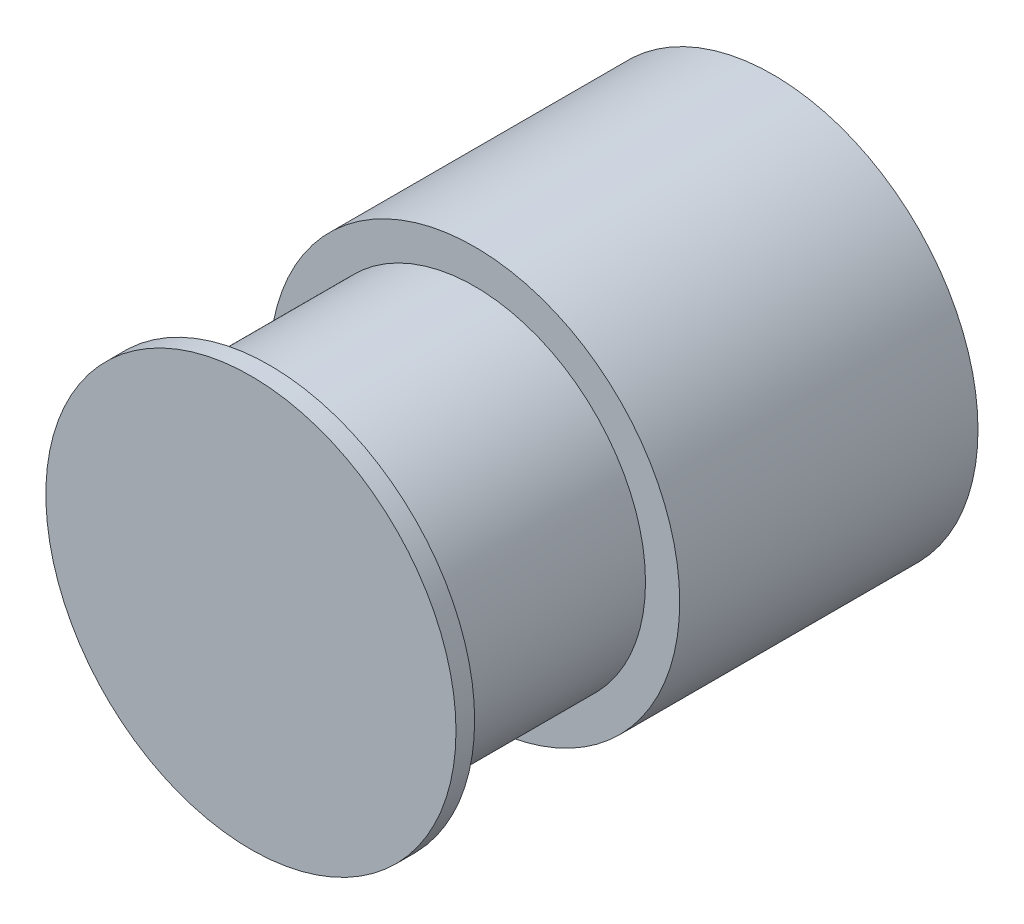
ISO-10303-21;
HEADER;
FILE_DESCRIPTION(('STEP AP214'),'2;1');
FILE_NAME('part.step','',(''),(''),'','','');
FILE_SCHEMA(('AUTOMOTIVE_DESIGN { 1 0 10303 214 1 1 1 1 }'));
ENDSEC;
DATA;
#1=APPLICATION_CONTEXT('core data for automotive mechanical design processes');
#2=APPLICATION_PROTOCOL_DEFINITION('international standard','automotive_design',2000,#1);
#3=PRODUCT_CONTEXT('',#1,'mechanical');
#4=PRODUCT('Part','Part','',(#3));
#5=PRODUCT_RELATED_PRODUCT_CATEGORY('part','',(#4));
#6=PRODUCT_DEFINITION_FORMATION('','',#4);
#7=PRODUCT_DEFINITION_CONTEXT('part definition',#1,'design');
#8=PRODUCT_DEFINITION('design','',#6,#7);
#9=PRODUCT_DEFINITION_SHAPE('','',#8);
#10=(LENGTH_UNIT() NAMED_UNIT(*) SI_UNIT(.MILLI.,.METRE.));
#11=(NAMED_UNIT(*) PLANE_ANGLE_UNIT() SI_UNIT($,.RADIAN.));
#12=(NAMED_UNIT(*) SI_UNIT($,.STERADIAN.) SOLID_ANGLE_UNIT());
#13=UNCERTAINTY_MEASURE_WITH_UNIT(LENGTH_MEASURE(1.E-05),#10,'distance_accuracy_value','');
#14=(GEOMETRIC_REPRESENTATION_CONTEXT(3) GLOBAL_UNCERTAINTY_ASSIGNED_CONTEXT((#13)) GLOBAL_UNIT_ASSIGNED_CONTEXT((#10,
#11,#12)) REPRESENTATION_CONTEXT('',''));
#15=CARTESIAN_POINT('',(0.,0.,0.));
#16=DIRECTION('',(0.,0.,1.));
#17=DIRECTION('',(1.,0.,0.));
#18=AXIS2_PLACEMENT_3D('',#15,#16,#17);
#19=CARTESIAN_POINT('',(0.,0.,16.));
#20=DIRECTION('',(0.,0.,1.));
#21=DIRECTION('',(1.,0.,0.));
#22=AXIS2_PLACEMENT_3D('',#19,#20,#21);
#23=PLANE('',#22);
#24=CARTESIAN_POINT('',(0.,0.,16.));
#25=DIRECTION('',(0.,0.,1.));
#26=DIRECTION('',(1.,0.,0.));
#27=AXIS2_PLACEMENT_3D('',#24,#25,#26);
#28=CIRCLE('',#27,9.165);
#29=CARTESIAN_POINT('',(9.165,0.,16.));
#30=VERTEX_POINT('',#29);
#31=EDGE_CURVE('E10',#30,#30,#28,.T.);
#32=ORIENTED_EDGE('',*,*,#31,.F.);
#33=EDGE_LOOP('',(#32));
#34=FACE_BOUND('',#33,.T.);
#35=CARTESIAN_POINT('',(0.,0.,16.));
#36=DIRECTION('',(0.,0.,1.));
#37=DIRECTION('',(1.,0.,0.));
#38=AXIS2_PLACEMENT_3D('',#35,#36,#37);
#39=CIRCLE('',#38,11.);
#40=CARTESIAN_POINT('',(11.,0.,16.));
#41=VERTEX_POINT('',#40);
#42=EDGE_CURVE('E44',#41,#41,#39,.T.);
#43=ORIENTED_EDGE('',*,*,#42,.T.);
#44=EDGE_LOOP('',(#43));
#45=FACE_BOUND('',#44,.T.);
#46=ADVANCED_FACE('F36',(#34,#45),#23,.T.);
#47=CARTESIAN_POINT('',(0.,0.,0.));
#48=DIRECTION('',(0.,0.,1.));
#49=DIRECTION('',(1.,0.,0.));
#50=AXIS2_PLACEMENT_3D('',#47,#48,#49);
#51=PLANE('',#50);
#52=CARTESIAN_POINT('',(0.,0.,0.));
#53=DIRECTION('',(0.,0.,1.));
#54=DIRECTION('',(1.,0.,0.));
#55=AXIS2_PLACEMENT_3D('',#52,#53,#54);
#56=CIRCLE('',#55,11.);
#57=CARTESIAN_POINT('',(11.,0.,0.));
#58=VERTEX_POINT('',#57);
#59=EDGE_CURVE('E40',#58,#58,#56,.T.);
#60=ORIENTED_EDGE('',*,*,#59,.F.);
#61=EDGE_LOOP('',(#60));
#62=FACE_BOUND('',#61,.T.);
#63=CARTESIAN_POINT('',(0.,0.,0.));
#64=DIRECTION('',(0.,0.,1.));
#65=DIRECTION('',(1.,0.,0.));
#66=AXIS2_PLACEMENT_3D('',#63,#64,#65);
#67=CIRCLE('',#66,2.5);
#68=CARTESIAN_POINT('',(2.5,0.,0.));
#69=VERTEX_POINT('',#68);
#70=EDGE_CURVE('E56',#69,#69,#67,.T.);
#71=ORIENTED_EDGE('',*,*,#70,.T.);
#72=EDGE_LOOP('',(#71));
#73=FACE_BOUND('',#72,.T.);
#74=ADVANCED_FACE('F64',(#62,#73),#51,.F.);
#75=CARTESIAN_POINT('',(0.,0.,16.));
#76=DIRECTION('',(0.,0.,-1.));
#77=DIRECTION('',(-1.,0.,0.));
#78=AXIS2_PLACEMENT_3D('',#75,#76,#77);
#79=CYLINDRICAL_SURFACE('',#78,11.);
#80=ORIENTED_EDGE('',*,*,#42,.F.);
#81=EDGE_LOOP('',(#80));
#82=FACE_BOUND('',#81,.T.);
#83=ORIENTED_EDGE('',*,*,#59,.T.);
#84=EDGE_LOOP('',(#83));
#85=FACE_BOUND('',#84,.T.);
#86=ADVANCED_FACE('F38',(#82,#85),#79,.T.);
#87=CARTESIAN_POINT('',(0.,0.,16.));
#88=DIRECTION('',(0.,0.,-1.));
#89=DIRECTION('',(-1.,0.,0.));
#90=AXIS2_PLACEMENT_3D('',#87,#88,#89);
#91=CYLINDRICAL_SURFACE('',#90,2.5);
#92=CARTESIAN_POINT('',(0.,0.,16.));
#93=DIRECTION('',(0.,0.,1.));
#94=DIRECTION('',(1.,0.,0.));
#95=AXIS2_PLACEMENT_3D('',#92,#93,#94);
#96=CIRCLE('',#95,2.5);
#97=CARTESIAN_POINT('',(2.5,0.,16.));
#98=VERTEX_POINT('',#97);
#99=EDGE_CURVE('E53',#98,#98,#96,.T.);
#100=ORIENTED_EDGE('',*,*,#99,.T.);
#101=EDGE_LOOP('',(#100));
#102=FACE_BOUND('',#101,.T.);
#103=ORIENTED_EDGE('',*,*,#70,.F.);
#104=EDGE_LOOP('',(#103));
#105=FACE_BOUND('',#104,.T.);
#106=ADVANCED_FACE('F70',(#102,#105),#91,.F.);
#107=CARTESIAN_POINT('',(0.,0.,27.));
#108=DIRECTION('',(0.,0.,-1.));
#109=DIRECTION('',(-1.,0.,0.));
#110=AXIS2_PLACEMENT_3D('',#107,#108,#109);
#111=CYLINDRICAL_SURFACE('',#110,9.165);
#112=CARTESIAN_POINT('',(0.,0.,27.));
#113=DIRECTION('',(0.,0.,1.));
#114=DIRECTION('',(1.,0.,0.));
#115=AXIS2_PLACEMENT_3D('',#112,#113,#114);
#116=CIRCLE('',#115,9.165);
#117=CARTESIAN_POINT('',(9.165,0.,27.));
#118=VERTEX_POINT('',#117);
#119=EDGE_CURVE('E51',#118,#118,#116,.T.);
#120=ORIENTED_EDGE('',*,*,#119,.F.);
#121=EDGE_LOOP('',(#120));
#122=FACE_BOUND('',#121,.T.);
#123=ORIENTED_EDGE('',*,*,#31,.T.);
#124=EDGE_LOOP('',(#123));
#125=FACE_BOUND('',#124,.T.);
#126=ADVANCED_FACE('F77',(#122,#125),#111,.T.);
#127=CARTESIAN_POINT('',(0.,0.,16.));
#128=DIRECTION('',(0.,0.,1.));
#129=DIRECTION('',(1.,0.,0.));
#130=AXIS2_PLACEMENT_3D('',#127,#128,#129);
#131=PLANE('',#130);
#132=ORIENTED_EDGE('',*,*,#99,.F.);
#133=EDGE_LOOP('',(#132));
#134=FACE_BOUND('',#133,.T.);
#135=ADVANCED_FACE('F81',(#134),#131,.F.);
#136=CARTESIAN_POINT('',(0.,0.,28.));
#137=DIRECTION('',(0.,0.,-1.));
#138=DIRECTION('',(-1.,0.,0.));
#139=AXIS2_PLACEMENT_3D('',#136,#137,#138);
#140=CYLINDRICAL_SURFACE('',#139,11.);
#141=CARTESIAN_POINT('',(0.,0.,28.));
#142=DIRECTION('',(0.,0.,1.));
#143=DIRECTION('',(1.,0.,0.));
#144=AXIS2_PLACEMENT_3D('',#141,#142,#143);
#145=CIRCLE('',#144,11.);
#146=CARTESIAN_POINT('',(11.,0.,28.));
#147=VERTEX_POINT('',#146);
#148=EDGE_CURVE('E101',#147,#147,#145,.T.);
#149=ORIENTED_EDGE('',*,*,#148,.F.);
#150=EDGE_LOOP('',(#149));
#151=FACE_BOUND('',#150,.T.);
#152=CARTESIAN_POINT('',(0.,0.,27.));
#153=DIRECTION('',(0.,0.,1.));
#154=DIRECTION('',(1.,0.,0.));
#155=AXIS2_PLACEMENT_3D('',#152,#153,#154);
#156=CIRCLE('',#155,11.);
#157=CARTESIAN_POINT('',(11.,0.,27.));
#158=VERTEX_POINT('',#157);
#159=EDGE_CURVE('E102',#158,#158,#156,.T.);
#160=ORIENTED_EDGE('',*,*,#159,.T.);
#161=EDGE_LOOP('',(#160));
#162=FACE_BOUND('',#161,.T.);
#163=ADVANCED_FACE('F85',(#151,#162),#140,.T.);
#164=CARTESIAN_POINT('',(0.,0.,28.));
#165=DIRECTION('',(0.,0.,1.));
#166=DIRECTION('',(1.,0.,0.));
#167=AXIS2_PLACEMENT_3D('',#164,#165,#166);
#168=PLANE('',#167);
#169=ORIENTED_EDGE('',*,*,#148,.T.);
#170=EDGE_LOOP('',(#169));
#171=FACE_BOUND('',#170,.T.);
#172=ADVANCED_FACE('F89',(#171),#168,.T.);
#173=CARTESIAN_POINT('',(0.,0.,27.));
#174=DIRECTION('',(0.,0.,1.));
#175=DIRECTION('',(1.,0.,0.));
#176=AXIS2_PLACEMENT_3D('',#173,#174,#175);
#177=PLANE('',#176);
#178=ORIENTED_EDGE('',*,*,#119,.T.);
#179=EDGE_LOOP('',(#178));
#180=FACE_BOUND('',#179,.T.);
#181=ORIENTED_EDGE('',*,*,#159,.F.);
#182=EDGE_LOOP('',(#181));
#183=FACE_BOUND('',#182,.T.);
#184=ADVANCED_FACE('F91',(#180,#183),#177,.F.);
#185=CLOSED_SHELL('',(#46,#74,#86,#106,#126,#135,#163,#172,#184));
#186=MANIFOLD_SOLID_BREP('B2',#185);
#187=ADVANCED_BREP_SHAPE_REPRESENTATION('',(#18,#186),#14);
#188=SHAPE_DEFINITION_REPRESENTATION(#9,#187);
ENDSEC;
END-ISO-10303-21;
